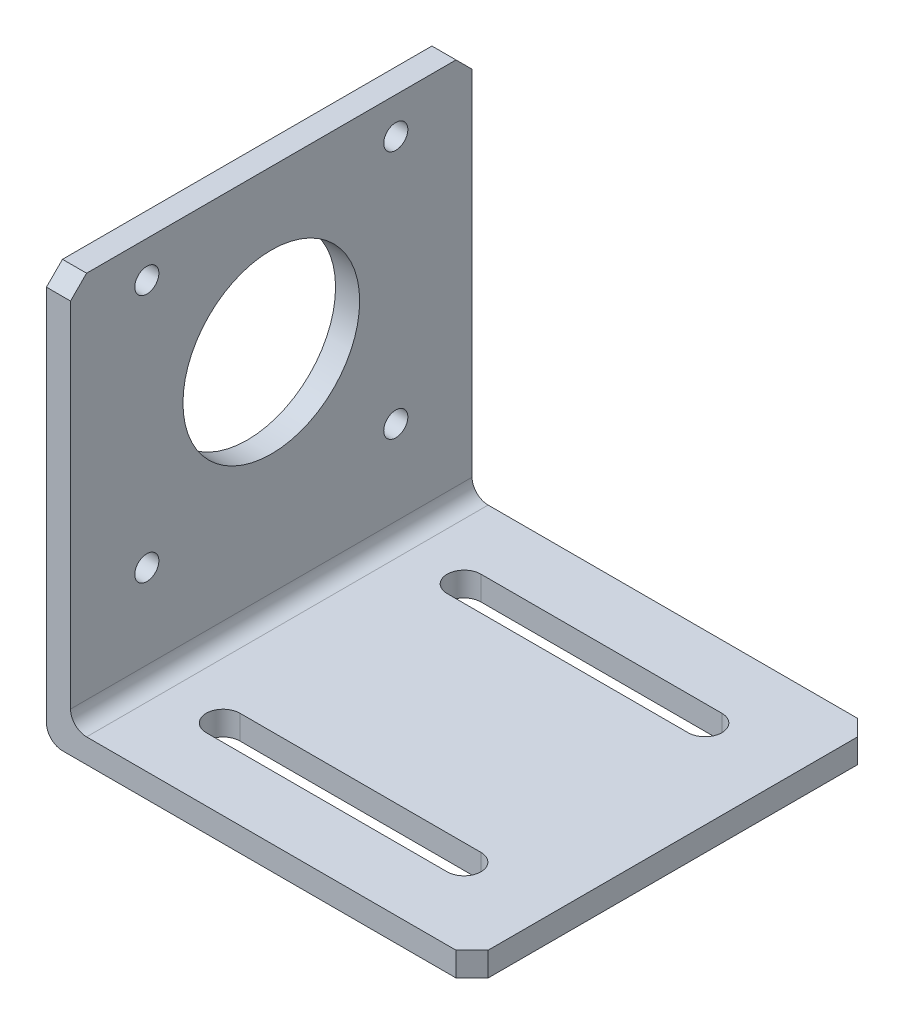
ISO-10303-21;
HEADER;
FILE_DESCRIPTION(('STEP AP214'),'2;1');
FILE_NAME('part.step','',(''),(''),'','','');
FILE_SCHEMA(('AUTOMOTIVE_DESIGN { 1 0 10303 214 1 1 1 1 }'));
ENDSEC;
DATA;
#1=APPLICATION_CONTEXT('core data for automotive mechanical design processes');
#2=APPLICATION_PROTOCOL_DEFINITION('international standard','automotive_design',2000,#1);
#3=PRODUCT_CONTEXT('',#1,'mechanical');
#4=PRODUCT('Part','Part','',(#3));
#5=PRODUCT_RELATED_PRODUCT_CATEGORY('part','',(#4));
#6=PRODUCT_DEFINITION_FORMATION('','',#4);
#7=PRODUCT_DEFINITION_CONTEXT('part definition',#1,'design');
#8=PRODUCT_DEFINITION('design','',#6,#7);
#9=PRODUCT_DEFINITION_SHAPE('','',#8);
#10=(LENGTH_UNIT() NAMED_UNIT(*) SI_UNIT(.MILLI.,.METRE.));
#11=(NAMED_UNIT(*) PLANE_ANGLE_UNIT() SI_UNIT($,.RADIAN.));
#12=(NAMED_UNIT(*) SI_UNIT($,.STERADIAN.) SOLID_ANGLE_UNIT());
#13=UNCERTAINTY_MEASURE_WITH_UNIT(LENGTH_MEASURE(1.E-05),#10,'distance_accuracy_value','');
#14=(GEOMETRIC_REPRESENTATION_CONTEXT(3) GLOBAL_UNCERTAINTY_ASSIGNED_CONTEXT((#13)) GLOBAL_UNIT_ASSIGNED_CONTEXT((#10,
#11,#12)) REPRESENTATION_CONTEXT('',''));
#15=CARTESIAN_POINT('',(0.,0.,0.));
#16=DIRECTION('',(0.,0.,1.));
#17=DIRECTION('',(1.,0.,0.));
#18=AXIS2_PLACEMENT_3D('',#15,#16,#17);
#19=CARTESIAN_POINT('',(2.,2.,0.));
#20=DIRECTION('',(0.,0.,1.));
#21=DIRECTION('',(1.,0.,0.));
#22=AXIS2_PLACEMENT_3D('',#19,#20,#21);
#23=PLANE('',#22);
#24=DIRECTION('',(0.,1.,0.));
#25=VECTOR('',#24,1.);
#26=CARTESIAN_POINT('',(51.,0.,0.));
#27=LINE('',#26,#25);
#28=CARTESIAN_POINT('',(51.,0.,0.));
#29=VERTEX_POINT('',#28);
#30=CARTESIAN_POINT('',(51.,3.,0.));
#31=VERTEX_POINT('',#30);
#32=EDGE_CURVE('E367',#29,#31,#27,.T.);
#33=ORIENTED_EDGE('',*,*,#32,.F.);
#34=DIRECTION('',(1.,0.,0.));
#35=VECTOR('',#34,1.);
#36=CARTESIAN_POINT('',(2.00000000000001,0.,0.));
#37=LINE('',#36,#35);
#38=CARTESIAN_POINT('',(2.00000000000001,0.,0.));
#39=VERTEX_POINT('',#38);
#40=EDGE_CURVE('E217',#39,#29,#37,.T.);
#41=ORIENTED_EDGE('',*,*,#40,.F.);
#42=CARTESIAN_POINT('',(2.,2.,0.));
#43=DIRECTION('',(0.,0.,1.));
#44=DIRECTION('',(1.,0.,0.));
#45=AXIS2_PLACEMENT_3D('',#42,#43,#44);
#46=CIRCLE('',#45,2.);
#47=CARTESIAN_POINT('',(0.,2.00000000000001,0.));
#48=VERTEX_POINT('',#47);
#49=EDGE_CURVE('E214',#48,#39,#46,.T.);
#50=ORIENTED_EDGE('',*,*,#49,.F.);
#51=DIRECTION('',(0.,-1.,0.));
#52=VECTOR('',#51,1.);
#53=CARTESIAN_POINT('',(0.,51.,0.));
#54=LINE('',#53,#52);
#55=CARTESIAN_POINT('',(0.,49.,0.));
#56=VERTEX_POINT('',#55);
#57=EDGE_CURVE('E212',#56,#48,#54,.T.);
#58=ORIENTED_EDGE('',*,*,#57,.F.);
#59=DIRECTION('',(1.,0.,0.));
#60=VECTOR('',#59,1.);
#61=CARTESIAN_POINT('',(0.,49.,0.));
#62=LINE('',#61,#60);
#63=CARTESIAN_POINT('',(3.,49.,0.));
#64=VERTEX_POINT('',#63);
#65=EDGE_CURVE('E307',#56,#64,#62,.T.);
#66=ORIENTED_EDGE('',*,*,#65,.T.);
#67=DIRECTION('',(0.,1.,0.));
#68=VECTOR('',#67,1.);
#69=CARTESIAN_POINT('',(3.,5.00000000000002,0.));
#70=LINE('',#69,#68);
#71=CARTESIAN_POINT('',(3.,5.,0.));
#72=VERTEX_POINT('',#71);
#73=EDGE_CURVE('E224',#72,#64,#70,.T.);
#74=ORIENTED_EDGE('',*,*,#73,.F.);
#75=CARTESIAN_POINT('',(5.,5.,0.));
#76=DIRECTION('',(0.,0.,-1.));
#77=DIRECTION('',(-1.,0.,0.));
#78=AXIS2_PLACEMENT_3D('',#75,#76,#77);
#79=CIRCLE('',#78,2.);
#80=CARTESIAN_POINT('',(5.00000000000001,3.,0.));
#81=VERTEX_POINT('',#80);
#82=EDGE_CURVE('E222',#81,#72,#79,.T.);
#83=ORIENTED_EDGE('',*,*,#82,.F.);
#84=DIRECTION('',(-1.,0.,0.));
#85=VECTOR('',#84,1.);
#86=CARTESIAN_POINT('',(53.,3.,0.));
#87=LINE('',#86,#85);
#88=EDGE_CURVE('E220',#31,#81,#87,.T.);
#89=ORIENTED_EDGE('',*,*,#88,.F.);
#90=EDGE_LOOP('',(#33,#41,#50,#58,#66,#74,#83,#89));
#91=FACE_BOUND('',#90,.T.);
#92=ADVANCED_FACE('F41',(#91),#23,.F.);
#93=CARTESIAN_POINT('',(2.00000000000001,0.,50.));
#94=DIRECTION('',(0.,1.,0.));
#95=DIRECTION('',(0.,0.,1.));
#96=AXIS2_PLACEMENT_3D('',#93,#94,#95);
#97=PLANE('',#96);
#98=DIRECTION('',(1.,0.,0.));
#99=VECTOR('',#98,1.);
#100=CARTESIAN_POINT('',(2.00000000000001,0.,42.1));
#101=LINE('',#100,#99);
#102=CARTESIAN_POINT('',(12.,0.,42.1));
#103=VERTEX_POINT('',#102);
#104=CARTESIAN_POINT('',(42.,0.,42.1));
#105=VERTEX_POINT('',#104);
#106=EDGE_CURVE('E317',#103,#105,#101,.T.);
#107=ORIENTED_EDGE('',*,*,#106,.T.);
#108=CARTESIAN_POINT('',(42.,0.,40.));
#109=DIRECTION('',(0.,1.,0.));
#110=DIRECTION('',(0.,0.,1.));
#111=AXIS2_PLACEMENT_3D('',#108,#109,#110);
#112=CIRCLE('',#111,2.1);
#113=CARTESIAN_POINT('',(42.,0.,37.9));
#114=VERTEX_POINT('',#113);
#115=EDGE_CURVE('E291',#105,#114,#112,.T.);
#116=ORIENTED_EDGE('',*,*,#115,.T.);
#117=DIRECTION('',(1.,0.,0.));
#118=VECTOR('',#117,1.);
#119=CARTESIAN_POINT('',(2.00000000000001,0.,37.9));
#120=LINE('',#119,#118);
#121=CARTESIAN_POINT('',(12.,0.,37.9));
#122=VERTEX_POINT('',#121);
#123=EDGE_CURVE('E320',#122,#114,#120,.T.);
#124=ORIENTED_EDGE('',*,*,#123,.F.);
#125=CARTESIAN_POINT('',(12.,0.,40.));
#126=DIRECTION('',(0.,1.,0.));
#127=DIRECTION('',(0.,0.,1.));
#128=AXIS2_PLACEMENT_3D('',#125,#126,#127);
#129=CIRCLE('',#128,2.1);
#130=EDGE_CURVE('E278',#122,#103,#129,.T.);
#131=ORIENTED_EDGE('',*,*,#130,.T.);
#132=EDGE_LOOP('',(#107,#116,#124,#131));
#133=FACE_BOUND('',#132,.T.);
#134=CARTESIAN_POINT('',(12.,0.,10.));
#135=DIRECTION('',(0.,1.,0.));
#136=DIRECTION('',(0.,0.,1.));
#137=AXIS2_PLACEMENT_3D('',#134,#135,#136);
#138=CIRCLE('',#137,2.1);
#139=CARTESIAN_POINT('',(12.,0.,12.1));
#140=VERTEX_POINT('',#139);
#141=CARTESIAN_POINT('',(12.,0.,7.9));
#142=VERTEX_POINT('',#141);
#143=EDGE_CURVE('E308',#140,#142,#138,.F.);
#144=ORIENTED_EDGE('',*,*,#143,.F.);
#145=DIRECTION('',(1.,0.,0.));
#146=VECTOR('',#145,1.);
#147=CARTESIAN_POINT('',(2.00000000000001,0.,12.1));
#148=LINE('',#147,#146);
#149=CARTESIAN_POINT('',(42.,0.,12.1));
#150=VERTEX_POINT('',#149);
#151=EDGE_CURVE('E314',#140,#150,#148,.T.);
#152=ORIENTED_EDGE('',*,*,#151,.T.);
#153=CARTESIAN_POINT('',(42.,0.,10.));
#154=DIRECTION('',(0.,1.,0.));
#155=DIRECTION('',(0.,0.,1.));
#156=AXIS2_PLACEMENT_3D('',#153,#154,#155);
#157=CIRCLE('',#156,2.1);
#158=CARTESIAN_POINT('',(42.,0.,7.9));
#159=VERTEX_POINT('',#158);
#160=EDGE_CURVE('E312',#159,#150,#157,.F.);
#161=ORIENTED_EDGE('',*,*,#160,.F.);
#162=DIRECTION('',(1.,0.,0.));
#163=VECTOR('',#162,1.);
#164=CARTESIAN_POINT('',(2.00000000000001,0.,7.9));
#165=LINE('',#164,#163);
#166=EDGE_CURVE('E310',#142,#159,#165,.T.);
#167=ORIENTED_EDGE('',*,*,#166,.F.);
#168=EDGE_LOOP('',(#144,#152,#161,#167));
#169=FACE_BOUND('',#168,.T.);
#170=DIRECTION('',(0.,0.,-1.));
#171=VECTOR('',#170,1.);
#172=CARTESIAN_POINT('',(53.,0.,50.));
#173=LINE('',#172,#171);
#174=CARTESIAN_POINT('',(53.,0.,48.));
#175=VERTEX_POINT('',#174);
#176=CARTESIAN_POINT('',(53.,0.,1.99999999999999));
#177=VERTEX_POINT('',#176);
#178=EDGE_CURVE('E193',#175,#177,#173,.T.);
#179=ORIENTED_EDGE('',*,*,#178,.F.);
#180=DIRECTION('',(-0.707106781186549,0.,0.707106781186546));
#181=VECTOR('',#180,1.);
#182=CARTESIAN_POINT('',(53.,0.,48.));
#183=LINE('',#182,#181);
#184=CARTESIAN_POINT('',(51.,0.,50.));
#185=VERTEX_POINT('',#184);
#186=EDGE_CURVE('E178',#175,#185,#183,.T.);
#187=ORIENTED_EDGE('',*,*,#186,.T.);
#188=DIRECTION('',(1.,0.,0.));
#189=VECTOR('',#188,1.);
#190=CARTESIAN_POINT('',(2.00000000000001,0.,50.));
#191=LINE('',#190,#189);
#192=CARTESIAN_POINT('',(2.00000000000001,0.,50.));
#193=VERTEX_POINT('',#192);
#194=EDGE_CURVE('E190',#193,#185,#191,.T.);
#195=ORIENTED_EDGE('',*,*,#194,.F.);
#196=DIRECTION('',(0.,0.,-1.));
#197=VECTOR('',#196,1.);
#198=CARTESIAN_POINT('',(2.00000000000001,0.,50.));
#199=LINE('',#198,#197);
#200=EDGE_CURVE('E239',#193,#39,#199,.T.);
#201=ORIENTED_EDGE('',*,*,#200,.T.);
#202=ORIENTED_EDGE('',*,*,#40,.T.);
#203=DIRECTION('',(-0.707106781186549,0.,-0.707106781186546));
#204=VECTOR('',#203,1.);
#205=CARTESIAN_POINT('',(53.,0.,1.99999999999999));
#206=LINE('',#205,#204);
#207=EDGE_CURVE('E369',#177,#29,#206,.T.);
#208=ORIENTED_EDGE('',*,*,#207,.F.);
#209=EDGE_LOOP('',(#179,#187,#195,#201,#202,#208));
#210=FACE_BOUND('',#209,.T.);
#211=ADVANCED_FACE('F188',(#133,#169,#210),#97,.F.);
#212=CARTESIAN_POINT('',(53.,3.,50.));
#213=DIRECTION('',(0.,-1.,0.));
#214=DIRECTION('',(0.,0.,-1.));
#215=AXIS2_PLACEMENT_3D('',#212,#213,#214);
#216=PLANE('',#215);
#217=DIRECTION('',(-1.,0.,0.));
#218=VECTOR('',#217,1.);
#219=CARTESIAN_POINT('',(53.,3.,37.9));
#220=LINE('',#219,#218);
#221=CARTESIAN_POINT('',(42.,3.,37.9));
#222=VERTEX_POINT('',#221);
#223=CARTESIAN_POINT('',(12.,3.,37.9));
#224=VERTEX_POINT('',#223);
#225=EDGE_CURVE('E49',#222,#224,#220,.T.);
#226=ORIENTED_EDGE('',*,*,#225,.F.);
#227=CARTESIAN_POINT('',(42.,3.,40.));
#228=DIRECTION('',(0.,-1.,0.));
#229=DIRECTION('',(0.,0.,-1.));
#230=AXIS2_PLACEMENT_3D('',#227,#228,#229);
#231=CIRCLE('',#230,2.1);
#232=CARTESIAN_POINT('',(42.,3.,42.1));
#233=VERTEX_POINT('',#232);
#234=EDGE_CURVE('E11',#222,#233,#231,.T.);
#235=ORIENTED_EDGE('',*,*,#234,.T.);
#236=DIRECTION('',(-1.,0.,0.));
#237=VECTOR('',#236,1.);
#238=CARTESIAN_POINT('',(53.,3.,42.1));
#239=LINE('',#238,#237);
#240=CARTESIAN_POINT('',(12.,3.,42.1));
#241=VERTEX_POINT('',#240);
#242=EDGE_CURVE('E257',#233,#241,#239,.T.);
#243=ORIENTED_EDGE('',*,*,#242,.T.);
#244=CARTESIAN_POINT('',(12.,3.,40.));
#245=DIRECTION('',(0.,-1.,0.));
#246=DIRECTION('',(0.,0.,-1.));
#247=AXIS2_PLACEMENT_3D('',#244,#245,#246);
#248=CIRCLE('',#247,2.1);
#249=EDGE_CURVE('E260',#241,#224,#248,.T.);
#250=ORIENTED_EDGE('',*,*,#249,.T.);
#251=EDGE_LOOP('',(#226,#235,#243,#250));
#252=FACE_BOUND('',#251,.T.);
#253=CARTESIAN_POINT('',(42.,3.,10.));
#254=DIRECTION('',(0.,-1.,0.));
#255=DIRECTION('',(0.,0.,-1.));
#256=AXIS2_PLACEMENT_3D('',#253,#254,#255);
#257=CIRCLE('',#256,2.1);
#258=CARTESIAN_POINT('',(42.,3.,12.1));
#259=VERTEX_POINT('',#258);
#260=CARTESIAN_POINT('',(42.,3.,7.9));
#261=VERTEX_POINT('',#260);
#262=EDGE_CURVE('E252',#259,#261,#257,.F.);
#263=ORIENTED_EDGE('',*,*,#262,.F.);
#264=DIRECTION('',(-1.,0.,0.));
#265=VECTOR('',#264,1.);
#266=CARTESIAN_POINT('',(53.,3.,12.1));
#267=LINE('',#266,#265);
#268=CARTESIAN_POINT('',(12.,3.,12.1));
#269=VERTEX_POINT('',#268);
#270=EDGE_CURVE('E254',#259,#269,#267,.T.);
#271=ORIENTED_EDGE('',*,*,#270,.T.);
#272=CARTESIAN_POINT('',(12.,3.,10.));
#273=DIRECTION('',(0.,-1.,0.));
#274=DIRECTION('',(0.,0.,-1.));
#275=AXIS2_PLACEMENT_3D('',#272,#273,#274);
#276=CIRCLE('',#275,2.1);
#277=CARTESIAN_POINT('',(12.,3.,7.9));
#278=VERTEX_POINT('',#277);
#279=EDGE_CURVE('E247',#278,#269,#276,.F.);
#280=ORIENTED_EDGE('',*,*,#279,.F.);
#281=DIRECTION('',(-1.,0.,0.));
#282=VECTOR('',#281,1.);
#283=CARTESIAN_POINT('',(53.,3.,7.9));
#284=LINE('',#283,#282);
#285=EDGE_CURVE('E249',#261,#278,#284,.T.);
#286=ORIENTED_EDGE('',*,*,#285,.F.);
#287=EDGE_LOOP('',(#263,#271,#280,#286));
#288=FACE_BOUND('',#287,.T.);
#289=DIRECTION('',(-1.,0.,0.));
#290=VECTOR('',#289,1.);
#291=CARTESIAN_POINT('',(53.,3.,50.));
#292=LINE('',#291,#290);
#293=CARTESIAN_POINT('',(51.,3.,50.));
#294=VERTEX_POINT('',#293);
#295=CARTESIAN_POINT('',(5.00000000000001,3.,50.));
#296=VERTEX_POINT('',#295);
#297=EDGE_CURVE('E199',#294,#296,#292,.T.);
#298=ORIENTED_EDGE('',*,*,#297,.F.);
#299=DIRECTION('',(-0.707106781186549,0.,0.707106781186546));
#300=VECTOR('',#299,1.);
#301=CARTESIAN_POINT('',(53.,3.,48.));
#302=LINE('',#301,#300);
#303=CARTESIAN_POINT('',(53.,3.,48.));
#304=VERTEX_POINT('',#303);
#305=EDGE_CURVE('E64',#304,#294,#302,.T.);
#306=ORIENTED_EDGE('',*,*,#305,.F.);
#307=DIRECTION('',(0.,0.,-1.));
#308=VECTOR('',#307,1.);
#309=CARTESIAN_POINT('',(53.,3.,50.));
#310=LINE('',#309,#308);
#311=CARTESIAN_POINT('',(53.,3.,1.99999999999999));
#312=VERTEX_POINT('',#311);
#313=EDGE_CURVE('E235',#304,#312,#310,.T.);
#314=ORIENTED_EDGE('',*,*,#313,.T.);
#315=DIRECTION('',(-0.707106781186549,0.,-0.707106781186546));
#316=VECTOR('',#315,1.);
#317=CARTESIAN_POINT('',(53.,3.,1.99999999999999));
#318=LINE('',#317,#316);
#319=EDGE_CURVE('E56',#312,#31,#318,.T.);
#320=ORIENTED_EDGE('',*,*,#319,.T.);
#321=ORIENTED_EDGE('',*,*,#88,.T.);
#322=DIRECTION('',(0.,0.,-1.));
#323=VECTOR('',#322,1.);
#324=CARTESIAN_POINT('',(5.00000000000001,3.,50.));
#325=LINE('',#324,#323);
#326=EDGE_CURVE('E232',#296,#81,#325,.T.);
#327=ORIENTED_EDGE('',*,*,#326,.F.);
#328=EDGE_LOOP('',(#298,#306,#314,#320,#321,#327));
#329=FACE_BOUND('',#328,.T.);
#330=ADVANCED_FACE('F281',(#252,#288,#329),#216,.F.);
#331=CARTESIAN_POINT('',(53.,0.,50.));
#332=DIRECTION('',(-1.,0.,0.));
#333=DIRECTION('',(0.,0.,1.));
#334=AXIS2_PLACEMENT_3D('',#331,#332,#333);
#335=PLANE('',#334);
#336=ORIENTED_EDGE('',*,*,#313,.F.);
#337=DIRECTION('',(0.,1.,0.));
#338=VECTOR('',#337,1.);
#339=CARTESIAN_POINT('',(53.,0.,48.));
#340=LINE('',#339,#338);
#341=EDGE_CURVE('E183',#175,#304,#340,.T.);
#342=ORIENTED_EDGE('',*,*,#341,.F.);
#343=ORIENTED_EDGE('',*,*,#178,.T.);
#344=DIRECTION('',(0.,1.,0.));
#345=VECTOR('',#344,1.);
#346=CARTESIAN_POINT('',(53.,0.,1.99999999999999));
#347=LINE('',#346,#345);
#348=EDGE_CURVE('E370',#177,#312,#347,.T.);
#349=ORIENTED_EDGE('',*,*,#348,.T.);
#350=EDGE_LOOP('',(#336,#342,#343,#349));
#351=FACE_BOUND('',#350,.T.);
#352=ADVANCED_FACE('F444',(#351),#335,.F.);
#353=CARTESIAN_POINT('',(0.,51.,50.));
#354=DIRECTION('',(1.,0.,0.));
#355=DIRECTION('',(0.,1.,0.));
#356=AXIS2_PLACEMENT_3D('',#353,#354,#355);
#357=PLANE('',#356);
#358=CARTESIAN_POINT('',(0.,15.5,40.5));
#359=DIRECTION('',(1.,0.,0.));
#360=DIRECTION('',(0.,0.,-1.));
#361=AXIS2_PLACEMENT_3D('',#358,#359,#360);
#362=CIRCLE('',#361,1.5);
#363=CARTESIAN_POINT('',(0.,15.5,39.));
#364=VERTEX_POINT('',#363);
#365=EDGE_CURVE('E340',#364,#364,#362,.T.);
#366=ORIENTED_EDGE('',*,*,#365,.T.);
#367=EDGE_LOOP('',(#366));
#368=FACE_BOUND('',#367,.T.);
#369=CARTESIAN_POINT('',(0.,31.,25.));
#370=DIRECTION('',(1.,0.,0.));
#371=DIRECTION('',(0.,0.,-1.));
#372=AXIS2_PLACEMENT_3D('',#369,#370,#371);
#373=CIRCLE('',#372,11.);
#374=CARTESIAN_POINT('',(0.,31.,14.));
#375=VERTEX_POINT('',#374);
#376=EDGE_CURVE('E328',#375,#375,#373,.T.);
#377=ORIENTED_EDGE('',*,*,#376,.T.);
#378=EDGE_LOOP('',(#377));
#379=FACE_BOUND('',#378,.T.);
#380=CARTESIAN_POINT('',(0.,46.5,40.5));
#381=DIRECTION('',(-1.,0.,0.));
#382=DIRECTION('',(0.,0.,1.));
#383=AXIS2_PLACEMENT_3D('',#380,#381,#382);
#384=CIRCLE('',#383,1.5);
#385=CARTESIAN_POINT('',(0.,46.5,42.));
#386=VERTEX_POINT('',#385);
#387=EDGE_CURVE('E215',#386,#386,#384,.T.);
#388=ORIENTED_EDGE('',*,*,#387,.F.);
#389=EDGE_LOOP('',(#388));
#390=FACE_BOUND('',#389,.T.);
#391=CARTESIAN_POINT('',(0.,46.5,9.5));
#392=DIRECTION('',(1.,0.,0.));
#393=DIRECTION('',(0.,0.,-1.));
#394=AXIS2_PLACEMENT_3D('',#391,#392,#393);
#395=CIRCLE('',#394,1.5);
#396=CARTESIAN_POINT('',(0.,46.5,8.));
#397=VERTEX_POINT('',#396);
#398=EDGE_CURVE('E334',#397,#397,#395,.T.);
#399=ORIENTED_EDGE('',*,*,#398,.T.);
#400=EDGE_LOOP('',(#399));
#401=FACE_BOUND('',#400,.T.);
#402=CARTESIAN_POINT('',(0.,15.5,9.5));
#403=DIRECTION('',(-1.,0.,0.));
#404=DIRECTION('',(0.,0.,1.));
#405=AXIS2_PLACEMENT_3D('',#402,#403,#404);
#406=CIRCLE('',#405,1.5);
#407=CARTESIAN_POINT('',(0.,15.5,11.));
#408=VERTEX_POINT('',#407);
#409=EDGE_CURVE('E323',#408,#408,#406,.T.);
#410=ORIENTED_EDGE('',*,*,#409,.F.);
#411=EDGE_LOOP('',(#410));
#412=FACE_BOUND('',#411,.T.);
#413=DIRECTION('',(0.,0.707106781186546,0.707106781186549));
#414=VECTOR('',#413,1.);
#415=CARTESIAN_POINT('',(0.,49.,0.));
#416=LINE('',#415,#414);
#417=CARTESIAN_POINT('',(0.,51.,2.));
#418=VERTEX_POINT('',#417);
#419=EDGE_CURVE('E376',#56,#418,#416,.T.);
#420=ORIENTED_EDGE('',*,*,#419,.F.);
#421=ORIENTED_EDGE('',*,*,#57,.T.);
#422=DIRECTION('',(0.,0.,-1.));
#423=VECTOR('',#422,1.);
#424=CARTESIAN_POINT('',(0.,2.00000000000001,50.));
#425=LINE('',#424,#423);
#426=CARTESIAN_POINT('',(0.,2.00000000000001,50.));
#427=VERTEX_POINT('',#426);
#428=EDGE_CURVE('E241',#427,#48,#425,.T.);
#429=ORIENTED_EDGE('',*,*,#428,.F.);
#430=DIRECTION('',(0.,-1.,0.));
#431=VECTOR('',#430,1.);
#432=CARTESIAN_POINT('',(0.,51.,50.));
#433=LINE('',#432,#431);
#434=CARTESIAN_POINT('',(0.,49.,50.));
#435=VERTEX_POINT('',#434);
#436=EDGE_CURVE('E203',#435,#427,#433,.T.);
#437=ORIENTED_EDGE('',*,*,#436,.F.);
#438=DIRECTION('',(0.,0.707106781186546,-0.707106781186549));
#439=VECTOR('',#438,1.);
#440=CARTESIAN_POINT('',(0.,49.,50.));
#441=LINE('',#440,#439);
#442=CARTESIAN_POINT('',(0.,51.,48.));
#443=VERTEX_POINT('',#442);
#444=EDGE_CURVE('E390',#435,#443,#441,.T.);
#445=ORIENTED_EDGE('',*,*,#444,.T.);
#446=DIRECTION('',(0.,0.,-1.));
#447=VECTOR('',#446,1.);
#448=CARTESIAN_POINT('',(0.,51.,50.));
#449=LINE('',#448,#447);
#450=EDGE_CURVE('E244',#443,#418,#449,.T.);
#451=ORIENTED_EDGE('',*,*,#450,.T.);
#452=EDGE_LOOP('',(#420,#421,#429,#437,#445,#451));
#453=FACE_BOUND('',#452,.T.);
#454=ADVANCED_FACE('F358',(#368,#379,#390,#401,#412,#453),#357,.F.);
#455=CARTESIAN_POINT('',(3.,5.00000000000002,50.));
#456=DIRECTION('',(-1.,0.,0.));
#457=DIRECTION('',(0.,0.,1.));
#458=AXIS2_PLACEMENT_3D('',#455,#456,#457);
#459=PLANE('',#458);
#460=CARTESIAN_POINT('',(3.,15.5,40.5));
#461=DIRECTION('',(1.,0.,0.));
#462=DIRECTION('',(0.,0.,-1.));
#463=AXIS2_PLACEMENT_3D('',#460,#461,#462);
#464=CIRCLE('',#463,1.5);
#465=CARTESIAN_POINT('',(3.,15.5,39.));
#466=VERTEX_POINT('',#465);
#467=EDGE_CURVE('E337',#466,#466,#464,.T.);
#468=ORIENTED_EDGE('',*,*,#467,.F.);
#469=EDGE_LOOP('',(#468));
#470=FACE_BOUND('',#469,.T.);
#471=CARTESIAN_POINT('',(3.,31.,25.));
#472=DIRECTION('',(1.,0.,0.));
#473=DIRECTION('',(0.,0.,-1.));
#474=AXIS2_PLACEMENT_3D('',#471,#472,#473);
#475=CIRCLE('',#474,11.);
#476=CARTESIAN_POINT('',(3.,31.,14.));
#477=VERTEX_POINT('',#476);
#478=EDGE_CURVE('E324',#477,#477,#475,.T.);
#479=ORIENTED_EDGE('',*,*,#478,.F.);
#480=EDGE_LOOP('',(#479));
#481=FACE_BOUND('',#480,.T.);
#482=CARTESIAN_POINT('',(3.,46.5,40.5));
#483=DIRECTION('',(-1.,0.,0.));
#484=DIRECTION('',(0.,0.,1.));
#485=AXIS2_PLACEMENT_3D('',#482,#483,#484);
#486=CIRCLE('',#485,1.5);
#487=CARTESIAN_POINT('',(3.,46.5,42.));
#488=VERTEX_POINT('',#487);
#489=EDGE_CURVE('E327',#488,#488,#486,.T.);
#490=ORIENTED_EDGE('',*,*,#489,.T.);
#491=EDGE_LOOP('',(#490));
#492=FACE_BOUND('',#491,.T.);
#493=CARTESIAN_POINT('',(3.,46.5,9.5));
#494=DIRECTION('',(1.,0.,0.));
#495=DIRECTION('',(0.,0.,-1.));
#496=AXIS2_PLACEMENT_3D('',#493,#494,#495);
#497=CIRCLE('',#496,1.5);
#498=CARTESIAN_POINT('',(3.,46.5,8.));
#499=VERTEX_POINT('',#498);
#500=EDGE_CURVE('E331',#499,#499,#497,.T.);
#501=ORIENTED_EDGE('',*,*,#500,.F.);
#502=EDGE_LOOP('',(#501));
#503=FACE_BOUND('',#502,.T.);
#504=CARTESIAN_POINT('',(3.,15.5,9.5));
#505=DIRECTION('',(-1.,0.,0.));
#506=DIRECTION('',(0.,0.,1.));
#507=AXIS2_PLACEMENT_3D('',#504,#505,#506);
#508=CIRCLE('',#507,1.5);
#509=CARTESIAN_POINT('',(3.,15.5,11.));
#510=VERTEX_POINT('',#509);
#511=EDGE_CURVE('E343',#510,#510,#508,.T.);
#512=ORIENTED_EDGE('',*,*,#511,.T.);
#513=EDGE_LOOP('',(#512));
#514=FACE_BOUND('',#513,.T.);
#515=DIRECTION('',(0.,0.707106781186546,0.707106781186549));
#516=VECTOR('',#515,1.);
#517=CARTESIAN_POINT('',(3.,49.,0.));
#518=LINE('',#517,#516);
#519=CARTESIAN_POINT('',(3.,51.,2.));
#520=VERTEX_POINT('',#519);
#521=EDGE_CURVE('E379',#64,#520,#518,.T.);
#522=ORIENTED_EDGE('',*,*,#521,.T.);
#523=DIRECTION('',(0.,0.,-1.));
#524=VECTOR('',#523,1.);
#525=CARTESIAN_POINT('',(3.,51.,50.));
#526=LINE('',#525,#524);
#527=CARTESIAN_POINT('',(3.,51.,48.));
#528=VERTEX_POINT('',#527);
#529=EDGE_CURVE('E211',#528,#520,#526,.T.);
#530=ORIENTED_EDGE('',*,*,#529,.F.);
#531=DIRECTION('',(0.,0.707106781186546,-0.707106781186549));
#532=VECTOR('',#531,1.);
#533=CARTESIAN_POINT('',(3.,49.,50.));
#534=LINE('',#533,#532);
#535=CARTESIAN_POINT('',(3.,49.,50.));
#536=VERTEX_POINT('',#535);
#537=EDGE_CURVE('E382',#536,#528,#534,.T.);
#538=ORIENTED_EDGE('',*,*,#537,.F.);
#539=DIRECTION('',(0.,1.,0.));
#540=VECTOR('',#539,1.);
#541=CARTESIAN_POINT('',(3.,5.00000000000002,50.));
#542=LINE('',#541,#540);
#543=CARTESIAN_POINT('',(3.,5.,50.));
#544=VERTEX_POINT('',#543);
#545=EDGE_CURVE('E208',#544,#536,#542,.T.);
#546=ORIENTED_EDGE('',*,*,#545,.F.);
#547=DIRECTION('',(0.,0.,-1.));
#548=VECTOR('',#547,1.);
#549=CARTESIAN_POINT('',(3.,5.,50.));
#550=LINE('',#549,#548);
#551=EDGE_CURVE('E229',#544,#72,#550,.T.);
#552=ORIENTED_EDGE('',*,*,#551,.T.);
#553=ORIENTED_EDGE('',*,*,#73,.T.);
#554=EDGE_LOOP('',(#522,#530,#538,#546,#552,#553));
#555=FACE_BOUND('',#554,.T.);
#556=ADVANCED_FACE('F434',(#470,#481,#492,#503,#514,#555),#459,.F.);
#557=CARTESIAN_POINT('',(3.,51.,50.));
#558=DIRECTION('',(0.,-1.,0.));
#559=DIRECTION('',(0.,0.,-1.));
#560=AXIS2_PLACEMENT_3D('',#557,#558,#559);
#561=PLANE('',#560);
#562=DIRECTION('',(1.,0.,0.));
#563=VECTOR('',#562,1.);
#564=CARTESIAN_POINT('',(0.,51.,2.));
#565=LINE('',#564,#563);
#566=EDGE_CURVE('E378',#418,#520,#565,.T.);
#567=ORIENTED_EDGE('',*,*,#566,.F.);
#568=ORIENTED_EDGE('',*,*,#450,.F.);
#569=DIRECTION('',(1.,0.,0.));
#570=VECTOR('',#569,1.);
#571=CARTESIAN_POINT('',(0.,51.,48.));
#572=LINE('',#571,#570);
#573=EDGE_CURVE('E386',#443,#528,#572,.T.);
#574=ORIENTED_EDGE('',*,*,#573,.T.);
#575=ORIENTED_EDGE('',*,*,#529,.T.);
#576=EDGE_LOOP('',(#567,#568,#574,#575));
#577=FACE_BOUND('',#576,.T.);
#578=ADVANCED_FACE('F43',(#577),#561,.F.);
#579=CARTESIAN_POINT('',(2.,2.,50.));
#580=DIRECTION('',(0.,0.,-1.));
#581=DIRECTION('',(-1.,0.,0.));
#582=AXIS2_PLACEMENT_3D('',#579,#580,#581);
#583=CYLINDRICAL_SURFACE('',#582,2.);
#584=ORIENTED_EDGE('',*,*,#49,.T.);
#585=ORIENTED_EDGE('',*,*,#200,.F.);
#586=CARTESIAN_POINT('',(2.,2.,50.));
#587=DIRECTION('',(0.,0.,1.));
#588=DIRECTION('',(1.,0.,0.));
#589=AXIS2_PLACEMENT_3D('',#586,#587,#588);
#590=CIRCLE('',#589,2.);
#591=EDGE_CURVE('E197',#427,#193,#590,.T.);
#592=ORIENTED_EDGE('',*,*,#591,.F.);
#593=ORIENTED_EDGE('',*,*,#428,.T.);
#594=EDGE_LOOP('',(#584,#585,#592,#593));
#595=FACE_BOUND('',#594,.T.);
#596=ADVANCED_FACE('F362',(#595),#583,.T.);
#597=CARTESIAN_POINT('',(5.,5.,50.));
#598=DIRECTION('',(0.,0.,-1.));
#599=DIRECTION('',(-1.,0.,0.));
#600=AXIS2_PLACEMENT_3D('',#597,#598,#599);
#601=CYLINDRICAL_SURFACE('',#600,2.);
#602=ORIENTED_EDGE('',*,*,#82,.T.);
#603=ORIENTED_EDGE('',*,*,#551,.F.);
#604=CARTESIAN_POINT('',(5.,5.,50.));
#605=DIRECTION('',(0.,0.,-1.));
#606=DIRECTION('',(-1.,0.,0.));
#607=AXIS2_PLACEMENT_3D('',#604,#605,#606);
#608=CIRCLE('',#607,2.);
#609=EDGE_CURVE('E201',#296,#544,#608,.T.);
#610=ORIENTED_EDGE('',*,*,#609,.F.);
#611=ORIENTED_EDGE('',*,*,#326,.T.);
#612=EDGE_LOOP('',(#602,#603,#610,#611));
#613=FACE_BOUND('',#612,.T.);
#614=ADVANCED_FACE('F438',(#613),#601,.F.);
#615=CARTESIAN_POINT('',(2.,2.,50.));
#616=DIRECTION('',(0.,0.,1.));
#617=DIRECTION('',(1.,0.,0.));
#618=AXIS2_PLACEMENT_3D('',#615,#616,#617);
#619=PLANE('',#618);
#620=DIRECTION('',(0.,1.,0.));
#621=VECTOR('',#620,1.);
#622=CARTESIAN_POINT('',(51.,0.,50.));
#623=LINE('',#622,#621);
#624=EDGE_CURVE('E175',#185,#294,#623,.T.);
#625=ORIENTED_EDGE('',*,*,#624,.T.);
#626=ORIENTED_EDGE('',*,*,#297,.T.);
#627=ORIENTED_EDGE('',*,*,#609,.T.);
#628=ORIENTED_EDGE('',*,*,#545,.T.);
#629=DIRECTION('',(1.,0.,0.));
#630=VECTOR('',#629,1.);
#631=CARTESIAN_POINT('',(0.,49.,50.));
#632=LINE('',#631,#630);
#633=EDGE_CURVE('E354',#435,#536,#632,.T.);
#634=ORIENTED_EDGE('',*,*,#633,.F.);
#635=ORIENTED_EDGE('',*,*,#436,.T.);
#636=ORIENTED_EDGE('',*,*,#591,.T.);
#637=ORIENTED_EDGE('',*,*,#194,.T.);
#638=EDGE_LOOP('',(#625,#626,#627,#628,#634,#635,#636,#637));
#639=FACE_BOUND('',#638,.T.);
#640=ADVANCED_FACE('F195',(#639),#619,.T.);
#641=CARTESIAN_POINT('',(0.,46.5,40.5));
#642=DIRECTION('',(1.,0.,0.));
#643=DIRECTION('',(0.,0.,-1.));
#644=AXIS2_PLACEMENT_3D('',#641,#642,#643);
#645=CYLINDRICAL_SURFACE('',#644,1.5);
#646=ORIENTED_EDGE('',*,*,#387,.T.);
#647=EDGE_LOOP('',(#646));
#648=FACE_BOUND('',#647,.T.);
#649=ORIENTED_EDGE('',*,*,#489,.F.);
#650=EDGE_LOOP('',(#649));
#651=FACE_BOUND('',#650,.T.);
#652=ADVANCED_FACE('F578',(#648,#651),#645,.F.);
#653=CARTESIAN_POINT('',(0.,31.,25.));
#654=DIRECTION('',(1.,0.,0.));
#655=DIRECTION('',(0.,0.,-1.));
#656=AXIS2_PLACEMENT_3D('',#653,#654,#655);
#657=CYLINDRICAL_SURFACE('',#656,11.);
#658=ORIENTED_EDGE('',*,*,#376,.F.);
#659=EDGE_LOOP('',(#658));
#660=FACE_BOUND('',#659,.T.);
#661=ORIENTED_EDGE('',*,*,#478,.T.);
#662=EDGE_LOOP('',(#661));
#663=FACE_BOUND('',#662,.T.);
#664=ADVANCED_FACE('F591',(#660,#663),#657,.F.);
#665=CARTESIAN_POINT('',(0.,46.5,9.5));
#666=DIRECTION('',(1.,0.,0.));
#667=DIRECTION('',(0.,0.,-1.));
#668=AXIS2_PLACEMENT_3D('',#665,#666,#667);
#669=CYLINDRICAL_SURFACE('',#668,1.5);
#670=ORIENTED_EDGE('',*,*,#398,.F.);
#671=EDGE_LOOP('',(#670));
#672=FACE_BOUND('',#671,.T.);
#673=ORIENTED_EDGE('',*,*,#500,.T.);
#674=EDGE_LOOP('',(#673));
#675=FACE_BOUND('',#674,.T.);
#676=ADVANCED_FACE('F600',(#672,#675),#669,.F.);
#677=CARTESIAN_POINT('',(0.,15.5,40.5));
#678=DIRECTION('',(1.,0.,0.));
#679=DIRECTION('',(0.,0.,-1.));
#680=AXIS2_PLACEMENT_3D('',#677,#678,#679);
#681=CYLINDRICAL_SURFACE('',#680,1.5);
#682=ORIENTED_EDGE('',*,*,#365,.F.);
#683=EDGE_LOOP('',(#682));
#684=FACE_BOUND('',#683,.T.);
#685=ORIENTED_EDGE('',*,*,#467,.T.);
#686=EDGE_LOOP('',(#685));
#687=FACE_BOUND('',#686,.T.);
#688=ADVANCED_FACE('F466',(#684,#687),#681,.F.);
#689=CARTESIAN_POINT('',(0.,15.5,9.5));
#690=DIRECTION('',(1.,0.,0.));
#691=DIRECTION('',(0.,0.,-1.));
#692=AXIS2_PLACEMENT_3D('',#689,#690,#691);
#693=CYLINDRICAL_SURFACE('',#692,1.5);
#694=ORIENTED_EDGE('',*,*,#409,.T.);
#695=EDGE_LOOP('',(#694));
#696=FACE_BOUND('',#695,.T.);
#697=ORIENTED_EDGE('',*,*,#511,.F.);
#698=EDGE_LOOP('',(#697));
#699=FACE_BOUND('',#698,.T.);
#700=ADVANCED_FACE('F423',(#696,#699),#693,.F.);
#701=CARTESIAN_POINT('',(42.,51.,12.1));
#702=DIRECTION('',(0.,0.,1.));
#703=DIRECTION('',(1.,0.,0.));
#704=AXIS2_PLACEMENT_3D('',#701,#702,#703);
#705=PLANE('',#704);
#706=DIRECTION('',(0.,-1.,0.));
#707=VECTOR('',#706,1.);
#708=CARTESIAN_POINT('',(12.,51.,12.1));
#709=LINE('',#708,#707);
#710=EDGE_CURVE('E293',#269,#140,#709,.T.);
#711=ORIENTED_EDGE('',*,*,#710,.F.);
#712=ORIENTED_EDGE('',*,*,#270,.F.);
#713=DIRECTION('',(0.,-1.,0.));
#714=VECTOR('',#713,1.);
#715=CARTESIAN_POINT('',(42.,51.,12.1));
#716=LINE('',#715,#714);
#717=EDGE_CURVE('E304',#259,#150,#716,.T.);
#718=ORIENTED_EDGE('',*,*,#717,.T.);
#719=ORIENTED_EDGE('',*,*,#151,.F.);
#720=EDGE_LOOP('',(#711,#712,#718,#719));
#721=FACE_BOUND('',#720,.T.);
#722=ADVANCED_FACE('F412',(#721),#705,.F.);
#723=CARTESIAN_POINT('',(42.,51.,10.));
#724=DIRECTION('',(0.,-1.,0.));
#725=DIRECTION('',(0.,0.,-1.));
#726=AXIS2_PLACEMENT_3D('',#723,#724,#725);
#727=CYLINDRICAL_SURFACE('',#726,2.1);
#728=ORIENTED_EDGE('',*,*,#160,.T.);
#729=ORIENTED_EDGE('',*,*,#717,.F.);
#730=ORIENTED_EDGE('',*,*,#262,.T.);
#731=DIRECTION('',(0.,-1.,0.));
#732=VECTOR('',#731,1.);
#733=CARTESIAN_POINT('',(42.,51.,7.9));
#734=LINE('',#733,#732);
#735=EDGE_CURVE('E301',#261,#159,#734,.T.);
#736=ORIENTED_EDGE('',*,*,#735,.T.);
#737=EDGE_LOOP('',(#728,#729,#730,#736));
#738=FACE_BOUND('',#737,.T.);
#739=ADVANCED_FACE('F415',(#738),#727,.F.);
#740=CARTESIAN_POINT('',(42.,51.,7.9));
#741=DIRECTION('',(0.,0.,1.));
#742=DIRECTION('',(1.,0.,0.));
#743=AXIS2_PLACEMENT_3D('',#740,#741,#742);
#744=PLANE('',#743);
#745=ORIENTED_EDGE('',*,*,#166,.T.);
#746=ORIENTED_EDGE('',*,*,#735,.F.);
#747=ORIENTED_EDGE('',*,*,#285,.T.);
#748=DIRECTION('',(0.,-1.,0.));
#749=VECTOR('',#748,1.);
#750=CARTESIAN_POINT('',(12.,51.,7.9));
#751=LINE('',#750,#749);
#752=EDGE_CURVE('E296',#278,#142,#751,.T.);
#753=ORIENTED_EDGE('',*,*,#752,.T.);
#754=EDGE_LOOP('',(#745,#746,#747,#753));
#755=FACE_BOUND('',#754,.T.);
#756=ADVANCED_FACE('F405',(#755),#744,.T.);
#757=CARTESIAN_POINT('',(12.,51.,10.));
#758=DIRECTION('',(0.,-1.,0.));
#759=DIRECTION('',(0.,0.,-1.));
#760=AXIS2_PLACEMENT_3D('',#757,#758,#759);
#761=CYLINDRICAL_SURFACE('',#760,2.1);
#762=ORIENTED_EDGE('',*,*,#143,.T.);
#763=ORIENTED_EDGE('',*,*,#752,.F.);
#764=ORIENTED_EDGE('',*,*,#279,.T.);
#765=ORIENTED_EDGE('',*,*,#710,.T.);
#766=EDGE_LOOP('',(#762,#763,#764,#765));
#767=FACE_BOUND('',#766,.T.);
#768=ADVANCED_FACE('F402',(#767),#761,.F.);
#769=CARTESIAN_POINT('',(42.,51.,40.));
#770=DIRECTION('',(0.,-1.,0.));
#771=DIRECTION('',(0.,0.,-1.));
#772=AXIS2_PLACEMENT_3D('',#769,#770,#771);
#773=CYLINDRICAL_SURFACE('',#772,2.1);
#774=DIRECTION('',(0.,-1.,0.));
#775=VECTOR('',#774,1.);
#776=CARTESIAN_POINT('',(42.,51.,42.1));
#777=LINE('',#776,#775);
#778=EDGE_CURVE('E286',#233,#105,#777,.T.);
#779=ORIENTED_EDGE('',*,*,#778,.F.);
#780=ORIENTED_EDGE('',*,*,#234,.F.);
#781=DIRECTION('',(0.,-1.,0.));
#782=VECTOR('',#781,1.);
#783=CARTESIAN_POINT('',(42.,51.,37.9));
#784=LINE('',#783,#782);
#785=EDGE_CURVE('E271',#222,#114,#784,.T.);
#786=ORIENTED_EDGE('',*,*,#785,.T.);
#787=ORIENTED_EDGE('',*,*,#115,.F.);
#788=EDGE_LOOP('',(#779,#780,#786,#787));
#789=FACE_BOUND('',#788,.T.);
#790=ADVANCED_FACE('F289',(#789),#773,.F.);
#791=CARTESIAN_POINT('',(42.,51.,37.9));
#792=DIRECTION('',(0.,0.,1.));
#793=DIRECTION('',(1.,0.,0.));
#794=AXIS2_PLACEMENT_3D('',#791,#792,#793);
#795=PLANE('',#794);
#796=ORIENTED_EDGE('',*,*,#123,.T.);
#797=ORIENTED_EDGE('',*,*,#785,.F.);
#798=ORIENTED_EDGE('',*,*,#225,.T.);
#799=DIRECTION('',(0.,-1.,0.));
#800=VECTOR('',#799,1.);
#801=CARTESIAN_POINT('',(12.,51.,37.9));
#802=LINE('',#801,#800);
#803=EDGE_CURVE('E268',#224,#122,#802,.T.);
#804=ORIENTED_EDGE('',*,*,#803,.T.);
#805=EDGE_LOOP('',(#796,#797,#798,#804));
#806=FACE_BOUND('',#805,.T.);
#807=ADVANCED_FACE('F267',(#806),#795,.T.);
#808=CARTESIAN_POINT('',(12.,51.,40.));
#809=DIRECTION('',(0.,-1.,0.));
#810=DIRECTION('',(0.,0.,-1.));
#811=AXIS2_PLACEMENT_3D('',#808,#809,#810);
#812=CYLINDRICAL_SURFACE('',#811,2.1);
#813=ORIENTED_EDGE('',*,*,#803,.F.);
#814=ORIENTED_EDGE('',*,*,#249,.F.);
#815=DIRECTION('',(0.,-1.,0.));
#816=VECTOR('',#815,1.);
#817=CARTESIAN_POINT('',(12.,51.,42.1));
#818=LINE('',#817,#816);
#819=EDGE_CURVE('E279',#241,#103,#818,.T.);
#820=ORIENTED_EDGE('',*,*,#819,.T.);
#821=ORIENTED_EDGE('',*,*,#130,.F.);
#822=EDGE_LOOP('',(#813,#814,#820,#821));
#823=FACE_BOUND('',#822,.T.);
#824=ADVANCED_FACE('F275',(#823),#812,.F.);
#825=CARTESIAN_POINT('',(42.,51.,42.1));
#826=DIRECTION('',(0.,0.,1.));
#827=DIRECTION('',(1.,0.,0.));
#828=AXIS2_PLACEMENT_3D('',#825,#826,#827);
#829=PLANE('',#828);
#830=ORIENTED_EDGE('',*,*,#819,.F.);
#831=ORIENTED_EDGE('',*,*,#242,.F.);
#832=ORIENTED_EDGE('',*,*,#778,.T.);
#833=ORIENTED_EDGE('',*,*,#106,.F.);
#834=EDGE_LOOP('',(#830,#831,#832,#833));
#835=FACE_BOUND('',#834,.T.);
#836=ADVANCED_FACE('F285',(#835),#829,.F.);
#837=CARTESIAN_POINT('',(0.,49.,0.));
#838=DIRECTION('',(0.,0.707106781186549,-0.707106781186546));
#839=DIRECTION('',(0.,0.707106781186546,0.707106781186549));
#840=AXIS2_PLACEMENT_3D('',#837,#838,#839);
#841=PLANE('',#840);
#842=ORIENTED_EDGE('',*,*,#521,.F.);
#843=ORIENTED_EDGE('',*,*,#65,.F.);
#844=ORIENTED_EDGE('',*,*,#419,.T.);
#845=ORIENTED_EDGE('',*,*,#566,.T.);
#846=EDGE_LOOP('',(#842,#843,#844,#845));
#847=FACE_BOUND('',#846,.T.);
#848=ADVANCED_FACE('F480',(#847),#841,.T.);
#849=CARTESIAN_POINT('',(0.,49.,50.));
#850=DIRECTION('',(0.,-0.707106781186549,-0.707106781186546));
#851=DIRECTION('',(0.,0.707106781186546,-0.707106781186549));
#852=AXIS2_PLACEMENT_3D('',#849,#850,#851);
#853=PLANE('',#852);
#854=ORIENTED_EDGE('',*,*,#537,.T.);
#855=ORIENTED_EDGE('',*,*,#573,.F.);
#856=ORIENTED_EDGE('',*,*,#444,.F.);
#857=ORIENTED_EDGE('',*,*,#633,.T.);
#858=EDGE_LOOP('',(#854,#855,#856,#857));
#859=FACE_BOUND('',#858,.T.);
#860=ADVANCED_FACE('F479',(#859),#853,.F.);
#861=CARTESIAN_POINT('',(53.,0.,48.));
#862=DIRECTION('',(-0.707106781186546,0.,-0.707106781186549));
#863=DIRECTION('',(-0.707106781186549,0.,0.707106781186546));
#864=AXIS2_PLACEMENT_3D('',#861,#862,#863);
#865=PLANE('',#864);
#866=ORIENTED_EDGE('',*,*,#305,.T.);
#867=ORIENTED_EDGE('',*,*,#624,.F.);
#868=ORIENTED_EDGE('',*,*,#186,.F.);
#869=ORIENTED_EDGE('',*,*,#341,.T.);
#870=EDGE_LOOP('',(#866,#867,#868,#869));
#871=FACE_BOUND('',#870,.T.);
#872=ADVANCED_FACE('F177',(#871),#865,.F.);
#873=CARTESIAN_POINT('',(53.,0.,1.99999999999999));
#874=DIRECTION('',(0.707106781186546,0.,-0.707106781186549));
#875=DIRECTION('',(-0.707106781186549,0.,-0.707106781186546));
#876=AXIS2_PLACEMENT_3D('',#873,#874,#875);
#877=PLANE('',#876);
#878=ORIENTED_EDGE('',*,*,#319,.F.);
#879=ORIENTED_EDGE('',*,*,#348,.F.);
#880=ORIENTED_EDGE('',*,*,#207,.T.);
#881=ORIENTED_EDGE('',*,*,#32,.T.);
#882=EDGE_LOOP('',(#878,#879,#880,#881));
#883=FACE_BOUND('',#882,.T.);
#884=ADVANCED_FACE('F489',(#883),#877,.T.);
#885=CLOSED_SHELL('',(#92,#211,#330,#352,#454,#556,#578,#596,#614,#640,#652,#664,#676,#688,#700,
#722,#739,#756,#768,#790,#807,#824,#836,#848,#860,#872,#884));
#886=MANIFOLD_SOLID_BREP('B2',#885);
#887=ADVANCED_BREP_SHAPE_REPRESENTATION('',(#18,#886),#14);
#888=SHAPE_DEFINITION_REPRESENTATION(#9,#887);
ENDSEC;
END-ISO-10303-21;
